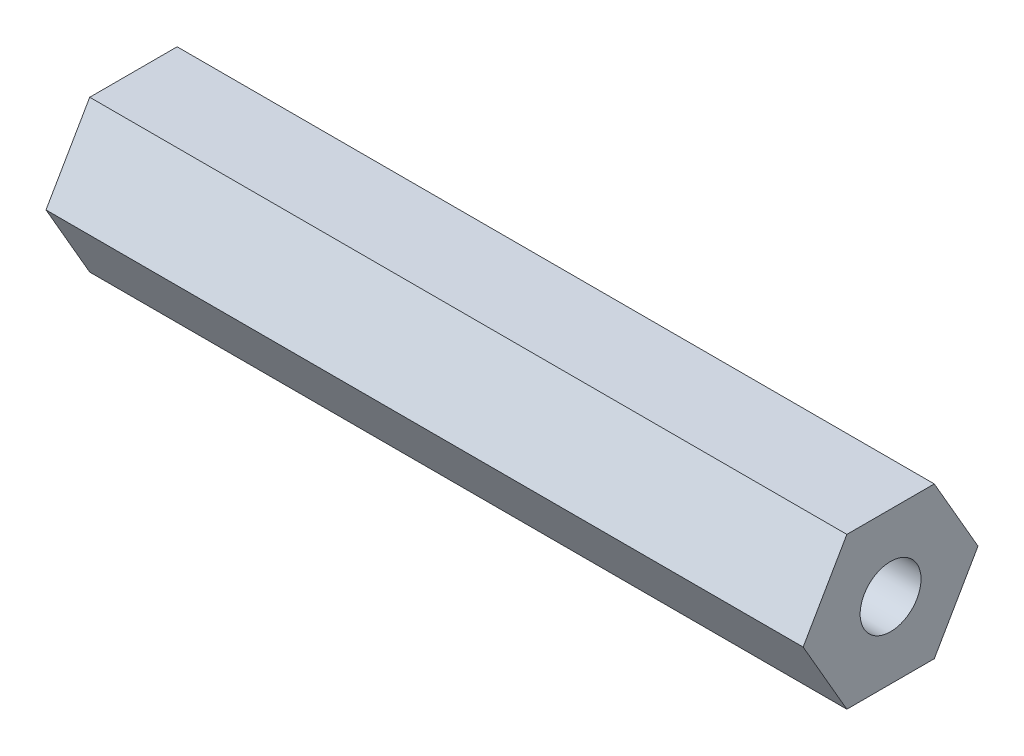
ISO-10303-21;
HEADER;
FILE_DESCRIPTION(('STEP AP214'),'2;1');
FILE_NAME('part.step','',(''),(''),'','','');
FILE_SCHEMA(('AUTOMOTIVE_DESIGN { 1 0 10303 214 1 1 1 1 }'));
ENDSEC;
DATA;
#1=APPLICATION_CONTEXT('core data for automotive mechanical design processes');
#2=APPLICATION_PROTOCOL_DEFINITION('international standard','automotive_design',2000,#1);
#3=PRODUCT_CONTEXT('',#1,'mechanical');
#4=PRODUCT('Part','Part','',(#3));
#5=PRODUCT_RELATED_PRODUCT_CATEGORY('part','',(#4));
#6=PRODUCT_DEFINITION_FORMATION('','',#4);
#7=PRODUCT_DEFINITION_CONTEXT('part definition',#1,'design');
#8=PRODUCT_DEFINITION('design','',#6,#7);
#9=PRODUCT_DEFINITION_SHAPE('','',#8);
#10=(LENGTH_UNIT() NAMED_UNIT(*) SI_UNIT(.MILLI.,.METRE.));
#11=(NAMED_UNIT(*) PLANE_ANGLE_UNIT() SI_UNIT($,.RADIAN.));
#12=(NAMED_UNIT(*) SI_UNIT($,.STERADIAN.) SOLID_ANGLE_UNIT());
#13=UNCERTAINTY_MEASURE_WITH_UNIT(LENGTH_MEASURE(1.E-05),#10,'distance_accuracy_value','');
#14=(GEOMETRIC_REPRESENTATION_CONTEXT(3) GLOBAL_UNCERTAINTY_ASSIGNED_CONTEXT((#13)) GLOBAL_UNIT_ASSIGNED_CONTEXT((#10,
#11,#12)) REPRESENTATION_CONTEXT('',''));
#15=CARTESIAN_POINT('',(0.,0.,0.));
#16=DIRECTION('',(0.,0.,1.));
#17=DIRECTION('',(1.,0.,0.));
#18=AXIS2_PLACEMENT_3D('',#15,#16,#17);
#19=CARTESIAN_POINT('',(63.5,-6.34999999999993,-3.66617420935418));
#20=DIRECTION('',(0.,0.499999999999995,0.866025403784441));
#21=DIRECTION('',(0.,-0.866025403784441,0.499999999999995));
#22=AXIS2_PLACEMENT_3D('',#19,#20,#21);
#23=PLANE('',#22);
#24=DIRECTION('',(0.,0.866025403784441,-0.499999999999995));
#25=VECTOR('',#24,1.);
#26=CARTESIAN_POINT('',(0.,-6.34999999999993,-3.66617420935418));
#27=LINE('',#26,#25);
#28=CARTESIAN_POINT('',(0.,-6.34999999999993,-3.66617420935418));
#29=VERTEX_POINT('',#28);
#30=CARTESIAN_POINT('',(0.,0.,-7.33234841870822));
#31=VERTEX_POINT('',#30);
#32=EDGE_CURVE('E125',#29,#31,#27,.T.);
#33=ORIENTED_EDGE('',*,*,#32,.T.);
#34=DIRECTION('',(-1.,0.,0.));
#35=VECTOR('',#34,1.);
#36=CARTESIAN_POINT('',(63.5,0.,-7.33234841870822));
#37=LINE('',#36,#35);
#38=CARTESIAN_POINT('',(63.5,0.,-7.33234841870822));
#39=VERTEX_POINT('',#38);
#40=EDGE_CURVE('E11',#39,#31,#37,.T.);
#41=ORIENTED_EDGE('',*,*,#40,.F.);
#42=DIRECTION('',(0.,0.866025403784441,-0.499999999999995));
#43=VECTOR('',#42,1.);
#44=CARTESIAN_POINT('',(63.5,-6.34999999999993,-3.66617420935418));
#45=LINE('',#44,#43);
#46=CARTESIAN_POINT('',(63.5,-6.34999999999993,-3.66617420935418));
#47=VERTEX_POINT('',#46);
#48=EDGE_CURVE('E136',#47,#39,#45,.T.);
#49=ORIENTED_EDGE('',*,*,#48,.F.);
#50=DIRECTION('',(-1.,0.,0.));
#51=VECTOR('',#50,1.);
#52=CARTESIAN_POINT('',(63.5,-6.34999999999993,-3.66617420935418));
#53=LINE('',#52,#51);
#54=EDGE_CURVE('E121',#47,#29,#53,.T.);
#55=ORIENTED_EDGE('',*,*,#54,.T.);
#56=EDGE_LOOP('',(#33,#41,#49,#55));
#57=FACE_BOUND('',#56,.T.);
#58=ADVANCED_FACE('F38',(#57),#23,.F.);
#59=CARTESIAN_POINT('',(63.5,0.,-7.33234841870822));
#60=DIRECTION('',(0.,-0.500000000000001,0.866025403784438));
#61=DIRECTION('',(0.,-0.866025403784438,-0.500000000000001));
#62=AXIS2_PLACEMENT_3D('',#59,#60,#61);
#63=PLANE('',#62);
#64=DIRECTION('',(0.,0.866025403784438,0.500000000000001));
#65=VECTOR('',#64,1.);
#66=CARTESIAN_POINT('',(0.,0.,-7.33234841870822));
#67=LINE('',#66,#65);
#68=CARTESIAN_POINT('',(0.,6.34999999999999,-3.6661742093541));
#69=VERTEX_POINT('',#68);
#70=EDGE_CURVE('E128',#31,#69,#67,.T.);
#71=ORIENTED_EDGE('',*,*,#70,.T.);
#72=DIRECTION('',(-1.,0.,0.));
#73=VECTOR('',#72,1.);
#74=CARTESIAN_POINT('',(63.5,6.34999999999999,-3.6661742093541));
#75=LINE('',#74,#73);
#76=CARTESIAN_POINT('',(63.5,6.34999999999999,-3.6661742093541));
#77=VERTEX_POINT('',#76);
#78=EDGE_CURVE('E46',#77,#69,#75,.T.);
#79=ORIENTED_EDGE('',*,*,#78,.F.);
#80=DIRECTION('',(0.,0.866025403784438,0.500000000000001));
#81=VECTOR('',#80,1.);
#82=CARTESIAN_POINT('',(63.5,0.,-7.33234841870822));
#83=LINE('',#82,#81);
#84=EDGE_CURVE('E92',#39,#77,#83,.T.);
#85=ORIENTED_EDGE('',*,*,#84,.F.);
#86=ORIENTED_EDGE('',*,*,#40,.T.);
#87=EDGE_LOOP('',(#71,#79,#85,#86));
#88=FACE_BOUND('',#87,.T.);
#89=ADVANCED_FACE('F161',(#88),#63,.F.);
#90=CARTESIAN_POINT('',(63.5,6.34999999999999,-3.6661742093541));
#91=DIRECTION('',(0.,-1.,0.));
#92=DIRECTION('',(0.,0.,-1.));
#93=AXIS2_PLACEMENT_3D('',#90,#91,#92);
#94=PLANE('',#93);
#95=DIRECTION('',(0.,0.,1.));
#96=VECTOR('',#95,1.);
#97=CARTESIAN_POINT('',(0.,6.34999999999999,-3.6661742093541));
#98=LINE('',#97,#96);
#99=CARTESIAN_POINT('',(0.,6.34999999999996,3.66617420935414));
#100=VERTEX_POINT('',#99);
#101=EDGE_CURVE('E131',#69,#100,#98,.T.);
#102=ORIENTED_EDGE('',*,*,#101,.T.);
#103=DIRECTION('',(-1.,0.,0.));
#104=VECTOR('',#103,1.);
#105=CARTESIAN_POINT('',(63.5,6.34999999999996,3.66617420935414));
#106=LINE('',#105,#104);
#107=CARTESIAN_POINT('',(63.5,6.34999999999996,3.66617420935414));
#108=VERTEX_POINT('',#107);
#109=EDGE_CURVE('E116',#108,#100,#106,.T.);
#110=ORIENTED_EDGE('',*,*,#109,.F.);
#111=DIRECTION('',(0.,0.,1.));
#112=VECTOR('',#111,1.);
#113=CARTESIAN_POINT('',(63.5,6.34999999999999,-3.6661742093541));
#114=LINE('',#113,#112);
#115=EDGE_CURVE('E107',#77,#108,#114,.T.);
#116=ORIENTED_EDGE('',*,*,#115,.F.);
#117=ORIENTED_EDGE('',*,*,#78,.T.);
#118=EDGE_LOOP('',(#102,#110,#116,#117));
#119=FACE_BOUND('',#118,.T.);
#120=ADVANCED_FACE('F142',(#119),#94,.F.);
#121=CARTESIAN_POINT('',(63.5,6.34999999999996,3.66617420935414));
#122=DIRECTION('',(0.,-0.499999999999995,-0.866025403784441));
#123=DIRECTION('',(0.,0.866025403784442,-0.499999999999995));
#124=AXIS2_PLACEMENT_3D('',#121,#122,#123);
#125=PLANE('',#124);
#126=DIRECTION('',(0.,-0.866025403784442,0.499999999999995));
#127=VECTOR('',#126,1.);
#128=CARTESIAN_POINT('',(0.,6.34999999999996,3.66617420935414));
#129=LINE('',#128,#127);
#130=CARTESIAN_POINT('',(0.,0.,7.33234841870822));
#131=VERTEX_POINT('',#130);
#132=EDGE_CURVE('E115',#100,#131,#129,.T.);
#133=ORIENTED_EDGE('',*,*,#132,.T.);
#134=DIRECTION('',(-1.,0.,0.));
#135=VECTOR('',#134,1.);
#136=CARTESIAN_POINT('',(63.5,0.,7.33234841870822));
#137=LINE('',#136,#135);
#138=CARTESIAN_POINT('',(63.5,0.,7.33234841870822));
#139=VERTEX_POINT('',#138);
#140=EDGE_CURVE('E112',#139,#131,#137,.T.);
#141=ORIENTED_EDGE('',*,*,#140,.F.);
#142=DIRECTION('',(0.,-0.866025403784442,0.499999999999995));
#143=VECTOR('',#142,1.);
#144=CARTESIAN_POINT('',(63.5,6.34999999999996,3.66617420935414));
#145=LINE('',#144,#143);
#146=EDGE_CURVE('E101',#108,#139,#145,.T.);
#147=ORIENTED_EDGE('',*,*,#146,.F.);
#148=ORIENTED_EDGE('',*,*,#109,.T.);
#149=EDGE_LOOP('',(#133,#141,#147,#148));
#150=FACE_BOUND('',#149,.T.);
#151=ADVANCED_FACE('F113',(#150),#125,.F.);
#152=CARTESIAN_POINT('',(63.5,0.,7.33234841870822));
#153=DIRECTION('',(0.,0.500000000000007,-0.866025403784434));
#154=DIRECTION('',(0.,0.866025403784435,0.500000000000007));
#155=AXIS2_PLACEMENT_3D('',#152,#153,#154);
#156=PLANE('',#155);
#157=DIRECTION('',(0.,-0.866025403784434,-0.500000000000007));
#158=VECTOR('',#157,1.);
#159=CARTESIAN_POINT('',(0.,0.,7.33234841870822));
#160=LINE('',#159,#158);
#161=CARTESIAN_POINT('',(0.,-6.35000000000001,3.66617420935405));
#162=VERTEX_POINT('',#161);
#163=EDGE_CURVE('E78',#131,#162,#160,.T.);
#164=ORIENTED_EDGE('',*,*,#163,.T.);
#165=DIRECTION('',(-1.,0.,0.));
#166=VECTOR('',#165,1.);
#167=CARTESIAN_POINT('',(63.5,-6.35000000000001,3.66617420935405));
#168=LINE('',#167,#166);
#169=CARTESIAN_POINT('',(63.5,-6.35000000000001,3.66617420935405));
#170=VERTEX_POINT('',#169);
#171=EDGE_CURVE('E117',#170,#162,#168,.T.);
#172=ORIENTED_EDGE('',*,*,#171,.F.);
#173=DIRECTION('',(0.,-0.866025403784434,-0.500000000000007));
#174=VECTOR('',#173,1.);
#175=CARTESIAN_POINT('',(63.5,0.,7.33234841870822));
#176=LINE('',#175,#174);
#177=EDGE_CURVE('E105',#139,#170,#176,.T.);
#178=ORIENTED_EDGE('',*,*,#177,.F.);
#179=ORIENTED_EDGE('',*,*,#140,.T.);
#180=EDGE_LOOP('',(#164,#172,#178,#179));
#181=FACE_BOUND('',#180,.T.);
#182=ADVANCED_FACE('F119',(#181),#156,.F.);
#183=CARTESIAN_POINT('',(63.5,-6.35000000000001,3.66617420935405));
#184=DIRECTION('',(0.,1.,0.));
#185=DIRECTION('',(0.,0.,1.));
#186=AXIS2_PLACEMENT_3D('',#183,#184,#185);
#187=PLANE('',#186);
#188=DIRECTION('',(0.,0.,-1.));
#189=VECTOR('',#188,1.);
#190=CARTESIAN_POINT('',(0.,-6.35000000000001,3.66617420935405));
#191=LINE('',#190,#189);
#192=EDGE_CURVE('E84',#162,#29,#191,.T.);
#193=ORIENTED_EDGE('',*,*,#192,.T.);
#194=ORIENTED_EDGE('',*,*,#54,.F.);
#195=DIRECTION('',(0.,0.,-1.));
#196=VECTOR('',#195,1.);
#197=CARTESIAN_POINT('',(63.5,-6.35000000000001,3.66617420935405));
#198=LINE('',#197,#196);
#199=EDGE_CURVE('E54',#170,#47,#198,.T.);
#200=ORIENTED_EDGE('',*,*,#199,.F.);
#201=ORIENTED_EDGE('',*,*,#171,.T.);
#202=EDGE_LOOP('',(#193,#194,#200,#201));
#203=FACE_BOUND('',#202,.T.);
#204=ADVANCED_FACE('F149',(#203),#187,.F.);
#205=CARTESIAN_POINT('',(63.5,0.,0.));
#206=DIRECTION('',(1.,0.,0.));
#207=DIRECTION('',(0.,0.,-1.));
#208=AXIS2_PLACEMENT_3D('',#205,#206,#207);
#209=PLANE('',#208);
#210=CARTESIAN_POINT('',(63.5,0.,0.));
#211=DIRECTION('',(1.,0.,0.));
#212=DIRECTION('',(0.,0.,-1.));
#213=AXIS2_PLACEMENT_3D('',#210,#211,#212);
#214=CIRCLE('',#213,2.55269999999999);
#215=CARTESIAN_POINT('',(63.5,0.,-2.55269999999999));
#216=VERTEX_POINT('',#215);
#217=EDGE_CURVE('E257',#216,#216,#214,.T.);
#218=ORIENTED_EDGE('',*,*,#217,.F.);
#219=EDGE_LOOP('',(#218));
#220=FACE_BOUND('',#219,.T.);
#221=ORIENTED_EDGE('',*,*,#48,.T.);
#222=ORIENTED_EDGE('',*,*,#84,.T.);
#223=ORIENTED_EDGE('',*,*,#115,.T.);
#224=ORIENTED_EDGE('',*,*,#146,.T.);
#225=ORIENTED_EDGE('',*,*,#177,.T.);
#226=ORIENTED_EDGE('',*,*,#199,.T.);
#227=EDGE_LOOP('',(#221,#222,#223,#224,#225,#226));
#228=FACE_BOUND('',#227,.T.);
#229=ADVANCED_FACE('F103',(#220,#228),#209,.T.);
#230=CARTESIAN_POINT('',(0.,0.,0.));
#231=DIRECTION('',(1.,0.,0.));
#232=DIRECTION('',(0.,0.,-1.));
#233=AXIS2_PLACEMENT_3D('',#230,#231,#232);
#234=PLANE('',#233);
#235=CARTESIAN_POINT('',(0.,0.,0.));
#236=DIRECTION('',(-1.,0.,0.));
#237=DIRECTION('',(0.,0.,1.));
#238=AXIS2_PLACEMENT_3D('',#235,#236,#237);
#239=CIRCLE('',#238,2.55269999999999);
#240=CARTESIAN_POINT('',(0.,0.,2.55269999999999));
#241=VERTEX_POINT('',#240);
#242=EDGE_CURVE('E255',#241,#241,#239,.T.);
#243=ORIENTED_EDGE('',*,*,#242,.F.);
#244=EDGE_LOOP('',(#243));
#245=FACE_BOUND('',#244,.T.);
#246=ORIENTED_EDGE('',*,*,#32,.F.);
#247=ORIENTED_EDGE('',*,*,#192,.F.);
#248=ORIENTED_EDGE('',*,*,#163,.F.);
#249=ORIENTED_EDGE('',*,*,#132,.F.);
#250=ORIENTED_EDGE('',*,*,#101,.F.);
#251=ORIENTED_EDGE('',*,*,#70,.F.);
#252=EDGE_LOOP('',(#246,#247,#248,#249,#250,#251));
#253=FACE_BOUND('',#252,.T.);
#254=ADVANCED_FACE('F145',(#245,#253),#234,.F.);
#255=CARTESIAN_POINT('',(46.99,0.,0.));
#256=DIRECTION('',(1.,0.,0.));
#257=DIRECTION('',(0.,0.,-1.));
#258=AXIS2_PLACEMENT_3D('',#255,#256,#257);
#259=CONICAL_SURFACE('',#258,2.55269999999999,1.02974425867665);
#260=CARTESIAN_POINT('',(45.4561830978084,0.,0.));
#261=VERTEX_POINT('',#260);
#262=VERTEX_LOOP('',#261);
#263=FACE_BOUND('',#262,.T.);
#264=CARTESIAN_POINT('',(46.99,0.,0.));
#265=DIRECTION('',(1.,0.,0.));
#266=DIRECTION('',(0.,0.,-1.));
#267=AXIS2_PLACEMENT_3D('',#264,#265,#266);
#268=CIRCLE('',#267,2.55269999999999);
#269=CARTESIAN_POINT('',(46.99,0.,-2.55269999999999));
#270=VERTEX_POINT('',#269);
#271=EDGE_CURVE('E129',#270,#270,#268,.T.);
#272=ORIENTED_EDGE('',*,*,#271,.T.);
#273=EDGE_LOOP('',(#272));
#274=FACE_BOUND('',#273,.T.);
#275=ADVANCED_FACE('F196',(#263,#274),#259,.F.);
#276=CARTESIAN_POINT('',(63.5,0.,0.));
#277=DIRECTION('',(1.,0.,0.));
#278=DIRECTION('',(0.,0.,-1.));
#279=AXIS2_PLACEMENT_3D('',#276,#277,#278);
#280=CYLINDRICAL_SURFACE('',#279,2.55269999999999);
#281=ORIENTED_EDGE('',*,*,#271,.F.);
#282=EDGE_LOOP('',(#281));
#283=FACE_BOUND('',#282,.T.);
#284=ORIENTED_EDGE('',*,*,#217,.T.);
#285=EDGE_LOOP('',(#284));
#286=FACE_BOUND('',#285,.T.);
#287=ADVANCED_FACE('F201',(#283,#286),#280,.F.);
#288=CARTESIAN_POINT('',(16.51,0.,0.));
#289=DIRECTION('',(-1.,0.,0.));
#290=DIRECTION('',(0.,0.,1.));
#291=AXIS2_PLACEMENT_3D('',#288,#289,#290);
#292=CONICAL_SURFACE('',#291,2.55269999999999,1.02974425867665);
#293=CARTESIAN_POINT('',(18.0438169021916,0.,0.));
#294=VERTEX_POINT('',#293);
#295=VERTEX_LOOP('',#294);
#296=FACE_BOUND('',#295,.T.);
#297=CARTESIAN_POINT('',(16.51,0.,0.));
#298=DIRECTION('',(-1.,0.,0.));
#299=DIRECTION('',(0.,0.,1.));
#300=AXIS2_PLACEMENT_3D('',#297,#298,#299);
#301=CIRCLE('',#300,2.55269999999999);
#302=CARTESIAN_POINT('',(16.51,0.,2.55269999999999));
#303=VERTEX_POINT('',#302);
#304=EDGE_CURVE('E252',#303,#303,#301,.T.);
#305=ORIENTED_EDGE('',*,*,#304,.T.);
#306=EDGE_LOOP('',(#305));
#307=FACE_BOUND('',#306,.T.);
#308=ADVANCED_FACE('F212',(#296,#307),#292,.F.);
#309=CARTESIAN_POINT('',(0.,0.,0.));
#310=DIRECTION('',(-1.,0.,0.));
#311=DIRECTION('',(0.,0.,1.));
#312=AXIS2_PLACEMENT_3D('',#309,#310,#311);
#313=CYLINDRICAL_SURFACE('',#312,2.55269999999999);
#314=ORIENTED_EDGE('',*,*,#304,.F.);
#315=EDGE_LOOP('',(#314));
#316=FACE_BOUND('',#315,.T.);
#317=ORIENTED_EDGE('',*,*,#242,.T.);
#318=EDGE_LOOP('',(#317));
#319=FACE_BOUND('',#318,.T.);
#320=ADVANCED_FACE('F230',(#316,#319),#313,.F.);
#321=CLOSED_SHELL('',(#58,#89,#120,#151,#182,#204,#229,#254,#275,#287,#308,#320));
#322=MANIFOLD_SOLID_BREP('B2',#321);
#323=ADVANCED_BREP_SHAPE_REPRESENTATION('',(#18,#322),#14);
#324=SHAPE_DEFINITION_REPRESENTATION(#9,#323);
ENDSEC;
END-ISO-10303-21;
